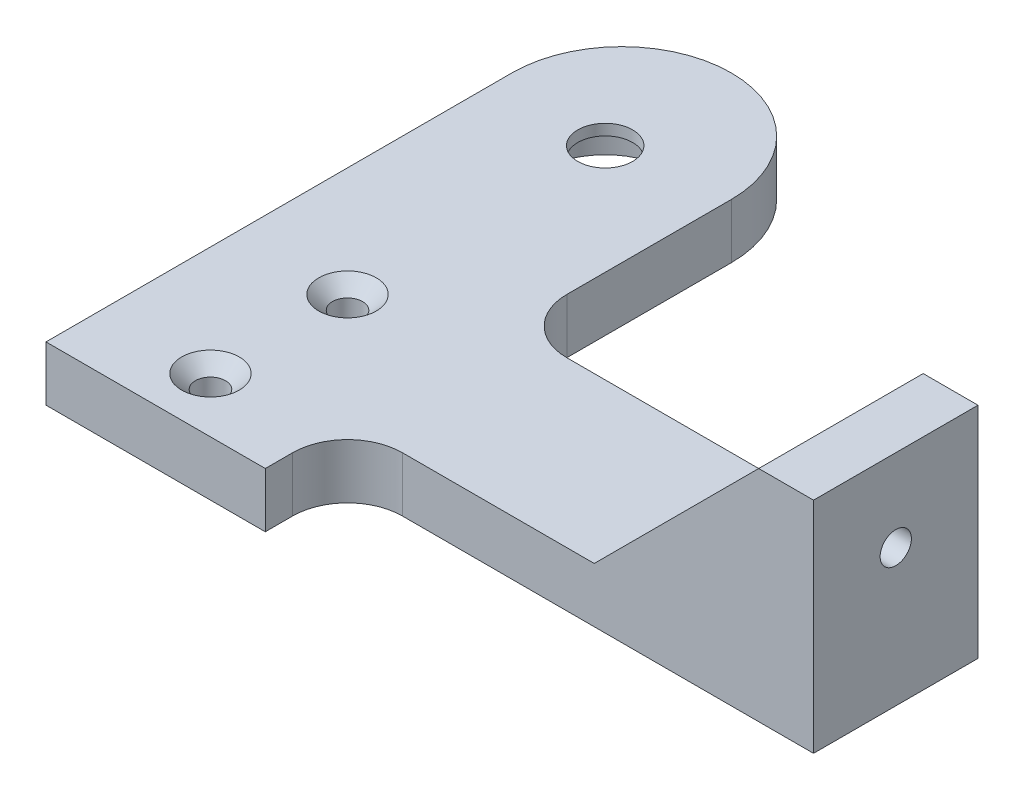
ISO-10303-21;
HEADER;
FILE_DESCRIPTION(('STEP AP214'),'2;1');
FILE_NAME('part.step','',(''),(''),'','','');
FILE_SCHEMA(('AUTOMOTIVE_DESIGN { 1 0 10303 214 1 1 1 1 }'));
ENDSEC;
DATA;
#1=APPLICATION_CONTEXT('core data for automotive mechanical design processes');
#2=APPLICATION_PROTOCOL_DEFINITION('international standard','automotive_design',2000,#1);
#3=PRODUCT_CONTEXT('',#1,'mechanical');
#4=PRODUCT('Part','Part','',(#3));
#5=PRODUCT_RELATED_PRODUCT_CATEGORY('part','',(#4));
#6=PRODUCT_DEFINITION_FORMATION('','',#4);
#7=PRODUCT_DEFINITION_CONTEXT('part definition',#1,'design');
#8=PRODUCT_DEFINITION('design','',#6,#7);
#9=PRODUCT_DEFINITION_SHAPE('','',#8);
#10=(LENGTH_UNIT() NAMED_UNIT(*) SI_UNIT(.MILLI.,.METRE.));
#11=(NAMED_UNIT(*) PLANE_ANGLE_UNIT() SI_UNIT($,.RADIAN.));
#12=(NAMED_UNIT(*) SI_UNIT($,.STERADIAN.) SOLID_ANGLE_UNIT());
#13=UNCERTAINTY_MEASURE_WITH_UNIT(LENGTH_MEASURE(1.E-05),#10,'distance_accuracy_value','');
#14=(GEOMETRIC_REPRESENTATION_CONTEXT(3) GLOBAL_UNCERTAINTY_ASSIGNED_CONTEXT((#13)) GLOBAL_UNIT_ASSIGNED_CONTEXT((#10,
#11,#12)) REPRESENTATION_CONTEXT('',''));
#15=CARTESIAN_POINT('',(0.,0.,0.));
#16=DIRECTION('',(0.,0.,1.));
#17=DIRECTION('',(1.,0.,0.));
#18=AXIS2_PLACEMENT_3D('',#15,#16,#17);
#19=CARTESIAN_POINT('',(95.,40.,-15.));
#20=DIRECTION('',(1.,0.,0.));
#21=DIRECTION('',(0.,0.,-1.));
#22=AXIS2_PLACEMENT_3D('',#19,#20,#21);
#23=PLANE('',#22);
#24=CARTESIAN_POINT('',(95.,25.,-30.));
#25=DIRECTION('',(1.,0.,0.));
#26=DIRECTION('',(0.,0.,-1.));
#27=AXIS2_PLACEMENT_3D('',#24,#25,#26);
#28=CIRCLE('',#27,2.85);
#29=CARTESIAN_POINT('',(95.,25.,-32.85));
#30=VERTEX_POINT('',#29);
#31=EDGE_CURVE('E182',#30,#30,#28,.T.);
#32=ORIENTED_EDGE('',*,*,#31,.T.);
#33=EDGE_LOOP('',(#32));
#34=FACE_BOUND('',#33,.T.);
#35=DIRECTION('',(0.,1.,0.));
#36=VECTOR('',#35,1.);
#37=CARTESIAN_POINT('',(95.,10.,-40.));
#38=LINE('',#37,#36);
#39=CARTESIAN_POINT('',(95.,13.5355339059327,-40.));
#40=VERTEX_POINT('',#39);
#41=CARTESIAN_POINT('',(95.,40.,-40.));
#42=VERTEX_POINT('',#41);
#43=EDGE_CURVE('E55',#40,#42,#38,.T.);
#44=ORIENTED_EDGE('',*,*,#43,.F.);
#45=DIRECTION('',(0.,0.,-1.));
#46=VECTOR('',#45,1.);
#47=CARTESIAN_POINT('',(95.,13.5355339059327,-15.));
#48=LINE('',#47,#46);
#49=CARTESIAN_POINT('',(95.,13.5355339059327,-20.));
#50=VERTEX_POINT('',#49);
#51=EDGE_CURVE('E205',#50,#40,#48,.T.);
#52=ORIENTED_EDGE('',*,*,#51,.F.);
#53=DIRECTION('',(0.,1.,0.));
#54=VECTOR('',#53,1.);
#55=CARTESIAN_POINT('',(95.,10.,-20.));
#56=LINE('',#55,#54);
#57=CARTESIAN_POINT('',(95.,39.9999999999997,-20.));
#58=VERTEX_POINT('',#57);
#59=EDGE_CURVE('E165',#50,#58,#56,.T.);
#60=ORIENTED_EDGE('',*,*,#59,.T.);
#61=DIRECTION('',(0.,0.,-1.));
#62=VECTOR('',#61,1.);
#63=CARTESIAN_POINT('',(95.,40.,-15.));
#64=LINE('',#63,#62);
#65=EDGE_CURVE('E207',#58,#42,#64,.T.);
#66=ORIENTED_EDGE('',*,*,#65,.T.);
#67=EDGE_LOOP('',(#44,#52,#60,#66));
#68=FACE_BOUND('',#67,.T.);
#69=ADVANCED_FACE('F39',(#34,#68),#23,.F.);
#70=CARTESIAN_POINT('',(95.,13.5355339059327,-15.));
#71=DIRECTION('',(0.707106781186543,-0.707106781186552,0.));
#72=DIRECTION('',(0.707106781186552,0.707106781186543,0.));
#73=AXIS2_PLACEMENT_3D('',#70,#71,#72);
#74=PLANE('',#73);
#75=DIRECTION('',(0.707106781186552,0.707106781186543,0.));
#76=VECTOR('',#75,1.);
#77=CARTESIAN_POINT('',(95.,13.5355339059327,-40.));
#78=LINE('',#77,#76);
#79=CARTESIAN_POINT('',(91.4644660940673,10.,-40.));
#80=VERTEX_POINT('',#79);
#81=EDGE_CURVE('E699',#80,#40,#78,.T.);
#82=ORIENTED_EDGE('',*,*,#81,.F.);
#83=DIRECTION('',(0.,0.,-1.));
#84=VECTOR('',#83,1.);
#85=CARTESIAN_POINT('',(91.4644660940673,10.,-15.));
#86=LINE('',#85,#84);
#87=CARTESIAN_POINT('',(91.4644660940672,10.,-20.));
#88=VERTEX_POINT('',#87);
#89=EDGE_CURVE('E196',#88,#80,#86,.T.);
#90=ORIENTED_EDGE('',*,*,#89,.F.);
#91=DIRECTION('',(-0.707106781186552,-0.707106781186543,0.));
#92=VECTOR('',#91,1.);
#93=CARTESIAN_POINT('',(95.,13.5355339059327,-20.));
#94=LINE('',#93,#92);
#95=EDGE_CURVE('E162',#50,#88,#94,.T.);
#96=ORIENTED_EDGE('',*,*,#95,.F.);
#97=ORIENTED_EDGE('',*,*,#51,.T.);
#98=EDGE_LOOP('',(#82,#90,#96,#97));
#99=FACE_BOUND('',#98,.T.);
#100=ADVANCED_FACE('F334',(#99),#74,.F.);
#101=CARTESIAN_POINT('',(0.,10.,-85.0000000000001));
#102=DIRECTION('',(0.,-1.,0.));
#103=DIRECTION('',(0.,0.,-1.));
#104=AXIS2_PLACEMENT_3D('',#101,#102,#103);
#105=PLANE('',#104);
#106=CARTESIAN_POINT('',(0.,10.,-35.));
#107=DIRECTION('',(0.,-1.,0.));
#108=DIRECTION('',(0.,0.,-1.));
#109=AXIS2_PLACEMENT_3D('',#106,#107,#108);
#110=CIRCLE('',#109,5.25);
#111=CARTESIAN_POINT('',(0.,10.,-40.25));
#112=VERTEX_POINT('',#111);
#113=EDGE_CURVE('E48',#112,#112,#110,.T.);
#114=ORIENTED_EDGE('',*,*,#113,.T.);
#115=EDGE_LOOP('',(#114));
#116=FACE_BOUND('',#115,.T.);
#117=CARTESIAN_POINT('',(0.,10.,-10.));
#118=DIRECTION('',(0.,-1.,0.));
#119=DIRECTION('',(0.,0.,-1.));
#120=AXIS2_PLACEMENT_3D('',#117,#118,#119);
#121=CIRCLE('',#120,5.25000000000001);
#122=CARTESIAN_POINT('',(0.,10.,-15.25));
#123=VERTEX_POINT('',#122);
#124=EDGE_CURVE('E294',#123,#123,#121,.T.);
#125=ORIENTED_EDGE('',*,*,#124,.T.);
#126=EDGE_LOOP('',(#125));
#127=FACE_BOUND('',#126,.T.);
#128=CARTESIAN_POINT('',(0.,10.,-82.));
#129=DIRECTION('',(0.,1.,0.));
#130=DIRECTION('',(0.,0.,1.));
#131=AXIS2_PLACEMENT_3D('',#128,#129,#130);
#132=CIRCLE('',#131,5.);
#133=CARTESIAN_POINT('',(0.,10.,-77.));
#134=VERTEX_POINT('',#133);
#135=EDGE_CURVE('E216',#134,#134,#132,.T.);
#136=ORIENTED_EDGE('',*,*,#135,.F.);
#137=EDGE_LOOP('',(#136));
#138=FACE_BOUND('',#137,.T.);
#139=DIRECTION('',(0.,0.,-1.));
#140=VECTOR('',#139,1.);
#141=CARTESIAN_POINT('',(65.,10.,-40.));
#142=LINE('',#141,#140);
#143=CARTESIAN_POINT('',(65.,10.,-40.));
#144=VERTEX_POINT('',#143);
#145=CARTESIAN_POINT('',(65.,10.,-45.));
#146=VERTEX_POINT('',#145);
#147=EDGE_CURVE('E701',#144,#146,#142,.T.);
#148=ORIENTED_EDGE('',*,*,#147,.T.);
#149=DIRECTION('',(-1.,0.,0.));
#150=VECTOR('',#149,1.);
#151=CARTESIAN_POINT('',(91.4644660940673,10.,-45.));
#152=LINE('',#151,#150);
#153=CARTESIAN_POINT('',(30.,10.,-45.));
#154=VERTEX_POINT('',#153);
#155=EDGE_CURVE('E190',#146,#154,#152,.T.);
#156=ORIENTED_EDGE('',*,*,#155,.T.);
#157=CARTESIAN_POINT('',(30.,10.,-55.));
#158=DIRECTION('',(0.,-1.,0.));
#159=DIRECTION('',(0.,0.,-1.));
#160=AXIS2_PLACEMENT_3D('',#157,#158,#159);
#161=CIRCLE('',#160,10.);
#162=CARTESIAN_POINT('',(20.,10.,-55.));
#163=VERTEX_POINT('',#162);
#164=EDGE_CURVE('E282',#154,#163,#161,.T.);
#165=ORIENTED_EDGE('',*,*,#164,.T.);
#166=DIRECTION('',(0.,0.,-1.));
#167=VECTOR('',#166,1.);
#168=CARTESIAN_POINT('',(20.,10.,0.));
#169=LINE('',#168,#167);
#170=CARTESIAN_POINT('',(20.,10.,-85.0000000000001));
#171=VERTEX_POINT('',#170);
#172=EDGE_CURVE('E227',#163,#171,#169,.T.);
#173=ORIENTED_EDGE('',*,*,#172,.T.);
#174=CARTESIAN_POINT('',(0.,10.,-85.0000000000001));
#175=DIRECTION('',(0.,1.,0.));
#176=DIRECTION('',(0.,0.,-1.));
#177=AXIS2_PLACEMENT_3D('',#174,#175,#176);
#178=CIRCLE('',#177,20.);
#179=CARTESIAN_POINT('',(-20.,10.,-85.0000000000001));
#180=VERTEX_POINT('',#179);
#181=EDGE_CURVE('E231',#171,#180,#178,.T.);
#182=ORIENTED_EDGE('',*,*,#181,.T.);
#183=DIRECTION('',(0.,0.,1.));
#184=VECTOR('',#183,1.);
#185=CARTESIAN_POINT('',(-20.,10.,-85.0000000000001));
#186=LINE('',#185,#184);
#187=CARTESIAN_POINT('',(-20.,10.,0.));
#188=VERTEX_POINT('',#187);
#189=EDGE_CURVE('E219',#180,#188,#186,.T.);
#190=ORIENTED_EDGE('',*,*,#189,.T.);
#191=DIRECTION('',(1.,0.,0.));
#192=VECTOR('',#191,1.);
#193=CARTESIAN_POINT('',(-20.,10.,0.));
#194=LINE('',#193,#192);
#195=CARTESIAN_POINT('',(20.,10.,0.));
#196=VERTEX_POINT('',#195);
#197=EDGE_CURVE('E224',#188,#196,#194,.T.);
#198=ORIENTED_EDGE('',*,*,#197,.T.);
#199=CARTESIAN_POINT('',(20.,10.,-5.));
#200=VERTEX_POINT('',#199);
#201=EDGE_CURVE('E228',#196,#200,#169,.T.);
#202=ORIENTED_EDGE('',*,*,#201,.T.);
#203=CARTESIAN_POINT('',(30.,10.,-5.));
#204=DIRECTION('',(0.,-1.,0.));
#205=DIRECTION('',(0.,0.,-1.));
#206=AXIS2_PLACEMENT_3D('',#203,#204,#205);
#207=CIRCLE('',#206,10.);
#208=CARTESIAN_POINT('',(30.,10.,-15.));
#209=VERTEX_POINT('',#208);
#210=EDGE_CURVE('E286',#200,#209,#207,.T.);
#211=ORIENTED_EDGE('',*,*,#210,.T.);
#212=DIRECTION('',(-1.,0.,0.));
#213=VECTOR('',#212,1.);
#214=CARTESIAN_POINT('',(91.4644660940673,10.,-15.));
#215=LINE('',#214,#213);
#216=CARTESIAN_POINT('',(65.,10.,-15.));
#217=VERTEX_POINT('',#216);
#218=EDGE_CURVE('E178',#217,#209,#215,.T.);
#219=ORIENTED_EDGE('',*,*,#218,.F.);
#220=DIRECTION('',(0.,0.,1.));
#221=VECTOR('',#220,1.);
#222=CARTESIAN_POINT('',(65.,10.,-20.));
#223=LINE('',#222,#221);
#224=CARTESIAN_POINT('',(65.,10.,-20.));
#225=VERTEX_POINT('',#224);
#226=EDGE_CURVE('E170',#225,#217,#223,.T.);
#227=ORIENTED_EDGE('',*,*,#226,.F.);
#228=DIRECTION('',(1.,0.,0.));
#229=VECTOR('',#228,1.);
#230=CARTESIAN_POINT('',(65.,10.,-20.));
#231=LINE('',#230,#229);
#232=EDGE_CURVE('E156',#225,#88,#231,.T.);
#233=ORIENTED_EDGE('',*,*,#232,.T.);
#234=ORIENTED_EDGE('',*,*,#89,.T.);
#235=DIRECTION('',(1.,0.,0.));
#236=VECTOR('',#235,1.);
#237=CARTESIAN_POINT('',(65.,10.,-40.));
#238=LINE('',#237,#236);
#239=EDGE_CURVE('E63',#144,#80,#238,.T.);
#240=ORIENTED_EDGE('',*,*,#239,.F.);
#241=EDGE_LOOP('',(#148,#156,#165,#173,#182,#190,#198,#202,#211,#219,#227,#233,#234,#240));
#242=FACE_BOUND('',#241,.T.);
#243=ADVANCED_FACE('F176',(#116,#127,#138,#242),#105,.F.);
#244=CARTESIAN_POINT('',(20.,8.,-85.0000000000001));
#245=DIRECTION('',(-1.,0.,0.));
#246=DIRECTION('',(0.,0.,1.));
#247=AXIS2_PLACEMENT_3D('',#244,#245,#246);
#248=PLANE('',#247);
#249=ORIENTED_EDGE('',*,*,#172,.F.);
#250=DIRECTION('',(0.,-1.,0.));
#251=VECTOR('',#250,1.);
#252=CARTESIAN_POINT('',(20.,0.,-55.));
#253=LINE('',#252,#251);
#254=CARTESIAN_POINT('',(20.,0.,-55.));
#255=VERTEX_POINT('',#254);
#256=EDGE_CURVE('E269',#163,#255,#253,.T.);
#257=ORIENTED_EDGE('',*,*,#256,.T.);
#258=DIRECTION('',(0.,0.,-1.));
#259=VECTOR('',#258,1.);
#260=CARTESIAN_POINT('',(20.,0.,-85.0000000000001));
#261=LINE('',#260,#259);
#262=CARTESIAN_POINT('',(20.,0.,-85.0000000000001));
#263=VERTEX_POINT('',#262);
#264=EDGE_CURVE('E253',#255,#263,#261,.T.);
#265=ORIENTED_EDGE('',*,*,#264,.T.);
#266=DIRECTION('',(0.,-1.,0.));
#267=VECTOR('',#266,1.);
#268=CARTESIAN_POINT('',(20.,8.,-85.0000000000001));
#269=LINE('',#268,#267);
#270=EDGE_CURVE('E257',#171,#263,#269,.T.);
#271=ORIENTED_EDGE('',*,*,#270,.F.);
#272=EDGE_LOOP('',(#249,#257,#265,#271));
#273=FACE_BOUND('',#272,.T.);
#274=ADVANCED_FACE('F318',(#273),#248,.F.);
#275=CARTESIAN_POINT('',(0.,0.,-85.0000000000001));
#276=DIRECTION('',(0.,-1.,0.));
#277=DIRECTION('',(0.,0.,-1.));
#278=AXIS2_PLACEMENT_3D('',#275,#276,#277);
#279=PLANE('',#278);
#280=CARTESIAN_POINT('',(0.,0.,-82.));
#281=DIRECTION('',(0.,1.,0.));
#282=DIRECTION('',(0.,0.,1.));
#283=AXIS2_PLACEMENT_3D('',#280,#281,#282);
#284=CIRCLE('',#283,12.1);
#285=CARTESIAN_POINT('',(0.,0.,-69.9));
#286=VERTEX_POINT('',#285);
#287=EDGE_CURVE('E238',#286,#286,#284,.T.);
#288=ORIENTED_EDGE('',*,*,#287,.T.);
#289=EDGE_LOOP('',(#288));
#290=FACE_BOUND('',#289,.T.);
#291=CARTESIAN_POINT('',(0.,0.,-85.0000000000001));
#292=DIRECTION('',(0.,1.,0.));
#293=DIRECTION('',(0.,0.,-1.));
#294=AXIS2_PLACEMENT_3D('',#291,#292,#293);
#295=CIRCLE('',#294,20.);
#296=CARTESIAN_POINT('',(-20.,0.,-85.0000000000001));
#297=VERTEX_POINT('',#296);
#298=EDGE_CURVE('E246',#263,#297,#295,.T.);
#299=ORIENTED_EDGE('',*,*,#298,.F.);
#300=ORIENTED_EDGE('',*,*,#264,.F.);
#301=CARTESIAN_POINT('',(30.,0.,-55.));
#302=DIRECTION('',(0.,-1.,0.));
#303=DIRECTION('',(0.,0.,-1.));
#304=AXIS2_PLACEMENT_3D('',#301,#302,#303);
#305=CIRCLE('',#304,10.);
#306=CARTESIAN_POINT('',(30.,0.,-45.));
#307=VERTEX_POINT('',#306);
#308=EDGE_CURVE('E280',#255,#307,#305,.F.);
#309=ORIENTED_EDGE('',*,*,#308,.T.);
#310=DIRECTION('',(1.,0.,0.));
#311=VECTOR('',#310,1.);
#312=CARTESIAN_POINT('',(20.,0.,-45.));
#313=LINE('',#312,#311);
#314=CARTESIAN_POINT('',(105.,0.,-45.));
#315=VERTEX_POINT('',#314);
#316=EDGE_CURVE('E197',#307,#315,#313,.T.);
#317=ORIENTED_EDGE('',*,*,#316,.T.);
#318=DIRECTION('',(0.,0.,-1.));
#319=VECTOR('',#318,1.);
#320=CARTESIAN_POINT('',(105.,0.,-15.));
#321=LINE('',#320,#319);
#322=CARTESIAN_POINT('',(105.,0.,-15.));
#323=VERTEX_POINT('',#322);
#324=EDGE_CURVE('E212',#323,#315,#321,.T.);
#325=ORIENTED_EDGE('',*,*,#324,.F.);
#326=DIRECTION('',(1.,0.,0.));
#327=VECTOR('',#326,1.);
#328=CARTESIAN_POINT('',(20.,0.,-15.));
#329=LINE('',#328,#327);
#330=CARTESIAN_POINT('',(30.,0.,-15.));
#331=VERTEX_POINT('',#330);
#332=EDGE_CURVE('E187',#331,#323,#329,.T.);
#333=ORIENTED_EDGE('',*,*,#332,.F.);
#334=CARTESIAN_POINT('',(30.,0.,-5.));
#335=DIRECTION('',(0.,-1.,0.));
#336=DIRECTION('',(0.,0.,-1.));
#337=AXIS2_PLACEMENT_3D('',#334,#335,#336);
#338=CIRCLE('',#337,10.);
#339=CARTESIAN_POINT('',(20.,0.,-5.));
#340=VERTEX_POINT('',#339);
#341=EDGE_CURVE('E284',#331,#340,#338,.F.);
#342=ORIENTED_EDGE('',*,*,#341,.T.);
#343=CARTESIAN_POINT('',(20.,0.,0.));
#344=VERTEX_POINT('',#343);
#345=EDGE_CURVE('E254',#344,#340,#261,.T.);
#346=ORIENTED_EDGE('',*,*,#345,.F.);
#347=DIRECTION('',(1.,0.,0.));
#348=VECTOR('',#347,1.);
#349=CARTESIAN_POINT('',(-20.,0.,0.));
#350=LINE('',#349,#348);
#351=CARTESIAN_POINT('',(-20.,0.,0.));
#352=VERTEX_POINT('',#351);
#353=EDGE_CURVE('E251',#352,#344,#350,.T.);
#354=ORIENTED_EDGE('',*,*,#353,.F.);
#355=DIRECTION('',(0.,0.,1.));
#356=VECTOR('',#355,1.);
#357=CARTESIAN_POINT('',(-20.,0.,-85.0000000000001));
#358=LINE('',#357,#356);
#359=EDGE_CURVE('E249',#297,#352,#358,.T.);
#360=ORIENTED_EDGE('',*,*,#359,.F.);
#361=EDGE_LOOP('',(#299,#300,#309,#317,#325,#333,#342,#346,#354,#360));
#362=FACE_BOUND('',#361,.T.);
#363=CARTESIAN_POINT('',(0.,0.,-10.));
#364=DIRECTION('',(0.,1.,0.));
#365=DIRECTION('',(0.,0.,1.));
#366=AXIS2_PLACEMENT_3D('',#363,#364,#365);
#367=CIRCLE('',#366,2.75);
#368=CARTESIAN_POINT('',(0.,0.,-7.25));
#369=VERTEX_POINT('',#368);
#370=EDGE_CURVE('E243',#369,#369,#367,.T.);
#371=ORIENTED_EDGE('',*,*,#370,.T.);
#372=EDGE_LOOP('',(#371));
#373=FACE_BOUND('',#372,.T.);
#374=CARTESIAN_POINT('',(0.,0.,-35.));
#375=DIRECTION('',(0.,1.,0.));
#376=DIRECTION('',(0.,0.,1.));
#377=AXIS2_PLACEMENT_3D('',#374,#375,#376);
#378=CIRCLE('',#377,2.75);
#379=CARTESIAN_POINT('',(0.,0.,-32.25));
#380=VERTEX_POINT('',#379);
#381=EDGE_CURVE('E235',#380,#380,#378,.T.);
#382=ORIENTED_EDGE('',*,*,#381,.T.);
#383=EDGE_LOOP('',(#382));
#384=FACE_BOUND('',#383,.T.);
#385=ADVANCED_FACE('F315',(#290,#362,#373,#384),#279,.T.);
#386=CARTESIAN_POINT('',(0.,8.,-85.0000000000001));
#387=DIRECTION('',(0.,-1.,0.));
#388=DIRECTION('',(0.,0.,-1.));
#389=AXIS2_PLACEMENT_3D('',#386,#387,#388);
#390=CYLINDRICAL_SURFACE('',#389,20.);
#391=ORIENTED_EDGE('',*,*,#298,.T.);
#392=DIRECTION('',(0.,-1.,0.));
#393=VECTOR('',#392,1.);
#394=CARTESIAN_POINT('',(-20.,8.,-85.0000000000001));
#395=LINE('',#394,#393);
#396=EDGE_CURVE('E266',#180,#297,#395,.T.);
#397=ORIENTED_EDGE('',*,*,#396,.F.);
#398=ORIENTED_EDGE('',*,*,#181,.F.);
#399=ORIENTED_EDGE('',*,*,#270,.T.);
#400=EDGE_LOOP('',(#391,#397,#398,#399));
#401=FACE_BOUND('',#400,.T.);
#402=ADVANCED_FACE('F317',(#401),#390,.T.);
#403=CARTESIAN_POINT('',(-20.,8.,-85.0000000000001));
#404=DIRECTION('',(1.,0.,0.));
#405=DIRECTION('',(0.,0.,-1.));
#406=AXIS2_PLACEMENT_3D('',#403,#404,#405);
#407=PLANE('',#406);
#408=ORIENTED_EDGE('',*,*,#359,.T.);
#409=DIRECTION('',(0.,-1.,0.));
#410=VECTOR('',#409,1.);
#411=CARTESIAN_POINT('',(-20.,8.,0.));
#412=LINE('',#411,#410);
#413=EDGE_CURVE('E263',#188,#352,#412,.T.);
#414=ORIENTED_EDGE('',*,*,#413,.F.);
#415=ORIENTED_EDGE('',*,*,#189,.F.);
#416=ORIENTED_EDGE('',*,*,#396,.T.);
#417=EDGE_LOOP('',(#408,#414,#415,#416));
#418=FACE_BOUND('',#417,.T.);
#419=ADVANCED_FACE('F325',(#418),#407,.F.);
#420=CARTESIAN_POINT('',(-20.,8.,0.));
#421=DIRECTION('',(0.,0.,-1.));
#422=DIRECTION('',(-1.,0.,0.));
#423=AXIS2_PLACEMENT_3D('',#420,#421,#422);
#424=PLANE('',#423);
#425=ORIENTED_EDGE('',*,*,#353,.T.);
#426=DIRECTION('',(0.,-1.,0.));
#427=VECTOR('',#426,1.);
#428=CARTESIAN_POINT('',(20.,8.,0.));
#429=LINE('',#428,#427);
#430=EDGE_CURVE('E260',#196,#344,#429,.T.);
#431=ORIENTED_EDGE('',*,*,#430,.F.);
#432=ORIENTED_EDGE('',*,*,#197,.F.);
#433=ORIENTED_EDGE('',*,*,#413,.T.);
#434=EDGE_LOOP('',(#425,#431,#432,#433));
#435=FACE_BOUND('',#434,.T.);
#436=ADVANCED_FACE('F370',(#435),#424,.F.);
#437=ORIENTED_EDGE('',*,*,#345,.T.);
#438=DIRECTION('',(0.,-1.,0.));
#439=VECTOR('',#438,1.);
#440=CARTESIAN_POINT('',(20.,8.,-5.));
#441=LINE('',#440,#439);
#442=EDGE_CURVE('E278',#340,#200,#441,.F.);
#443=ORIENTED_EDGE('',*,*,#442,.T.);
#444=ORIENTED_EDGE('',*,*,#201,.F.);
#445=ORIENTED_EDGE('',*,*,#430,.T.);
#446=EDGE_LOOP('',(#437,#443,#444,#445));
#447=FACE_BOUND('',#446,.T.);
#448=ADVANCED_FACE('F330',(#447),#248,.F.);
#449=CARTESIAN_POINT('',(0.,8.,-10.));
#450=DIRECTION('',(0.,-1.,0.));
#451=DIRECTION('',(0.,0.,-1.));
#452=AXIS2_PLACEMENT_3D('',#449,#450,#451);
#453=CYLINDRICAL_SURFACE('',#452,2.75);
#454=CARTESIAN_POINT('',(0.,7.50000000000001,-10.));
#455=DIRECTION('',(0.,-1.,0.));
#456=DIRECTION('',(0.,0.,-1.));
#457=AXIS2_PLACEMENT_3D('',#454,#455,#456);
#458=CIRCLE('',#457,2.75);
#459=CARTESIAN_POINT('',(0.,7.50000000000001,-12.75));
#460=VERTEX_POINT('',#459);
#461=EDGE_CURVE('E11',#460,#460,#458,.F.);
#462=ORIENTED_EDGE('',*,*,#461,.T.);
#463=EDGE_LOOP('',(#462));
#464=FACE_BOUND('',#463,.T.);
#465=ORIENTED_EDGE('',*,*,#370,.F.);
#466=EDGE_LOOP('',(#465));
#467=FACE_BOUND('',#466,.T.);
#468=ADVANCED_FACE('F363',(#464,#467),#453,.F.);
#469=CARTESIAN_POINT('',(0.,8.,-82.));
#470=DIRECTION('',(0.,-1.,0.));
#471=DIRECTION('',(0.,0.,-1.));
#472=AXIS2_PLACEMENT_3D('',#469,#470,#471);
#473=CYLINDRICAL_SURFACE('',#472,12.1);
#474=CARTESIAN_POINT('',(0.,8.,-82.));
#475=DIRECTION('',(0.,1.,0.));
#476=DIRECTION('',(0.,0.,1.));
#477=AXIS2_PLACEMENT_3D('',#474,#475,#476);
#478=CIRCLE('',#477,12.1);
#479=CARTESIAN_POINT('',(0.,8.,-69.9));
#480=VERTEX_POINT('',#479);
#481=EDGE_CURVE('E234',#480,#480,#478,.T.);
#482=ORIENTED_EDGE('',*,*,#481,.T.);
#483=EDGE_LOOP('',(#482));
#484=FACE_BOUND('',#483,.T.);
#485=ORIENTED_EDGE('',*,*,#287,.F.);
#486=EDGE_LOOP('',(#485));
#487=FACE_BOUND('',#486,.T.);
#488=ADVANCED_FACE('F311',(#484,#487),#473,.F.);
#489=CARTESIAN_POINT('',(0.,8.,-35.));
#490=DIRECTION('',(0.,-1.,0.));
#491=DIRECTION('',(0.,0.,-1.));
#492=AXIS2_PLACEMENT_3D('',#489,#490,#491);
#493=CYLINDRICAL_SURFACE('',#492,2.75);
#494=CARTESIAN_POINT('',(0.,7.50000000000001,-35.));
#495=DIRECTION('',(0.,-1.,0.));
#496=DIRECTION('',(0.,0.,-1.));
#497=AXIS2_PLACEMENT_3D('',#494,#495,#496);
#498=CIRCLE('',#497,2.75);
#499=CARTESIAN_POINT('',(0.,7.50000000000001,-37.75));
#500=VERTEX_POINT('',#499);
#501=EDGE_CURVE('E291',#500,#500,#498,.F.);
#502=ORIENTED_EDGE('',*,*,#501,.T.);
#503=EDGE_LOOP('',(#502));
#504=FACE_BOUND('',#503,.T.);
#505=ORIENTED_EDGE('',*,*,#381,.F.);
#506=EDGE_LOOP('',(#505));
#507=FACE_BOUND('',#506,.T.);
#508=ADVANCED_FACE('F307',(#504,#507),#493,.F.);
#509=CARTESIAN_POINT('',(0.,8.,-85.0000000000001));
#510=DIRECTION('',(0.,-1.,0.));
#511=DIRECTION('',(0.,0.,-1.));
#512=AXIS2_PLACEMENT_3D('',#509,#510,#511);
#513=PLANE('',#512);
#514=CARTESIAN_POINT('',(0.,8.,-82.));
#515=DIRECTION('',(0.,1.,0.));
#516=DIRECTION('',(0.,0.,1.));
#517=AXIS2_PLACEMENT_3D('',#514,#515,#516);
#518=CIRCLE('',#517,5.);
#519=CARTESIAN_POINT('',(0.,8.,-77.));
#520=VERTEX_POINT('',#519);
#521=EDGE_CURVE('E215',#520,#520,#518,.T.);
#522=ORIENTED_EDGE('',*,*,#521,.T.);
#523=EDGE_LOOP('',(#522));
#524=FACE_BOUND('',#523,.T.);
#525=ORIENTED_EDGE('',*,*,#481,.F.);
#526=EDGE_LOOP('',(#525));
#527=FACE_BOUND('',#526,.T.);
#528=ADVANCED_FACE('F310',(#524,#527),#513,.T.);
#529=CARTESIAN_POINT('',(0.,10.,-82.));
#530=DIRECTION('',(0.,-1.,0.));
#531=DIRECTION('',(0.,0.,-1.));
#532=AXIS2_PLACEMENT_3D('',#529,#530,#531);
#533=CYLINDRICAL_SURFACE('',#532,5.);
#534=ORIENTED_EDGE('',*,*,#135,.T.);
#535=EDGE_LOOP('',(#534));
#536=FACE_BOUND('',#535,.T.);
#537=ORIENTED_EDGE('',*,*,#521,.F.);
#538=EDGE_LOOP('',(#537));
#539=FACE_BOUND('',#538,.T.);
#540=ADVANCED_FACE('F352',(#536,#539),#533,.F.);
#541=CARTESIAN_POINT('',(105.,0.,-15.));
#542=DIRECTION('',(-1.,0.,0.));
#543=DIRECTION('',(0.,-1.,0.));
#544=AXIS2_PLACEMENT_3D('',#541,#542,#543);
#545=PLANE('',#544);
#546=CARTESIAN_POINT('',(105.,25.,-30.));
#547=DIRECTION('',(1.,0.,0.));
#548=DIRECTION('',(0.,1.,0.));
#549=AXIS2_PLACEMENT_3D('',#546,#547,#548);
#550=CIRCLE('',#549,2.85);
#551=CARTESIAN_POINT('',(105.,27.85,-30.));
#552=VERTEX_POINT('',#551);
#553=EDGE_CURVE('E179',#552,#552,#550,.T.);
#554=ORIENTED_EDGE('',*,*,#553,.F.);
#555=EDGE_LOOP('',(#554));
#556=FACE_BOUND('',#555,.T.);
#557=DIRECTION('',(0.,1.,0.));
#558=VECTOR('',#557,1.);
#559=CARTESIAN_POINT('',(105.,0.,-45.));
#560=LINE('',#559,#558);
#561=CARTESIAN_POINT('',(105.,40.,-45.));
#562=VERTEX_POINT('',#561);
#563=EDGE_CURVE('E199',#315,#562,#560,.T.);
#564=ORIENTED_EDGE('',*,*,#563,.T.);
#565=DIRECTION('',(0.,0.,-1.));
#566=VECTOR('',#565,1.);
#567=CARTESIAN_POINT('',(105.,40.,-15.));
#568=LINE('',#567,#566);
#569=CARTESIAN_POINT('',(105.,40.,-15.));
#570=VERTEX_POINT('',#569);
#571=EDGE_CURVE('E209',#570,#562,#568,.T.);
#572=ORIENTED_EDGE('',*,*,#571,.F.);
#573=DIRECTION('',(0.,1.,0.));
#574=VECTOR('',#573,1.);
#575=CARTESIAN_POINT('',(105.,0.,-15.));
#576=LINE('',#575,#574);
#577=EDGE_CURVE('E189',#323,#570,#576,.T.);
#578=ORIENTED_EDGE('',*,*,#577,.F.);
#579=ORIENTED_EDGE('',*,*,#324,.T.);
#580=EDGE_LOOP('',(#564,#572,#578,#579));
#581=FACE_BOUND('',#580,.T.);
#582=ADVANCED_FACE('F348',(#556,#581),#545,.F.);
#583=CARTESIAN_POINT('',(105.,40.,-15.));
#584=DIRECTION('',(0.,-1.,0.));
#585=DIRECTION('',(0.,0.,-1.));
#586=AXIS2_PLACEMENT_3D('',#583,#584,#585);
#587=PLANE('',#586);
#588=DIRECTION('',(-1.,0.,0.));
#589=VECTOR('',#588,1.);
#590=CARTESIAN_POINT('',(105.,40.,-45.));
#591=LINE('',#590,#589);
#592=CARTESIAN_POINT('',(95.,40.,-45.));
#593=VERTEX_POINT('',#592);
#594=EDGE_CURVE('E201',#562,#593,#591,.T.);
#595=ORIENTED_EDGE('',*,*,#594,.T.);
#596=DIRECTION('',(0.,0.,-1.));
#597=VECTOR('',#596,1.);
#598=CARTESIAN_POINT('',(95.,39.9999999999997,-40.));
#599=LINE('',#598,#597);
#600=EDGE_CURVE('E703',#42,#593,#599,.T.);
#601=ORIENTED_EDGE('',*,*,#600,.F.);
#602=ORIENTED_EDGE('',*,*,#65,.F.);
#603=CARTESIAN_POINT('',(95.,39.9999999999997,-15.));
#604=VERTEX_POINT('',#603);
#605=EDGE_CURVE('E173',#604,#58,#64,.T.);
#606=ORIENTED_EDGE('',*,*,#605,.F.);
#607=DIRECTION('',(-1.,0.,0.));
#608=VECTOR('',#607,1.);
#609=CARTESIAN_POINT('',(105.,40.,-15.));
#610=LINE('',#609,#608);
#611=EDGE_CURVE('E192',#570,#604,#610,.T.);
#612=ORIENTED_EDGE('',*,*,#611,.F.);
#613=ORIENTED_EDGE('',*,*,#571,.T.);
#614=EDGE_LOOP('',(#595,#601,#602,#606,#612,#613));
#615=FACE_BOUND('',#614,.T.);
#616=ADVANCED_FACE('F344',(#615),#587,.F.);
#617=CARTESIAN_POINT('',(0.,0.,-15.));
#618=DIRECTION('',(0.,0.,1.));
#619=DIRECTION('',(1.,0.,0.));
#620=AXIS2_PLACEMENT_3D('',#617,#618,#619);
#621=PLANE('',#620);
#622=ORIENTED_EDGE('',*,*,#611,.T.);
#623=DIRECTION('',(-0.707106781186551,-0.707106781186543,0.));
#624=VECTOR('',#623,1.);
#625=CARTESIAN_POINT('',(95.,39.9999999999997,-15.));
#626=LINE('',#625,#624);
#627=EDGE_CURVE('E174',#604,#217,#626,.T.);
#628=ORIENTED_EDGE('',*,*,#627,.T.);
#629=ORIENTED_EDGE('',*,*,#218,.T.);
#630=DIRECTION('',(0.,-1.,0.));
#631=VECTOR('',#630,1.);
#632=CARTESIAN_POINT('',(30.,0.,-15.));
#633=LINE('',#632,#631);
#634=EDGE_CURVE('E275',#209,#331,#633,.T.);
#635=ORIENTED_EDGE('',*,*,#634,.T.);
#636=ORIENTED_EDGE('',*,*,#332,.T.);
#637=ORIENTED_EDGE('',*,*,#577,.T.);
#638=EDGE_LOOP('',(#622,#628,#629,#635,#636,#637));
#639=FACE_BOUND('',#638,.T.);
#640=ADVANCED_FACE('F347',(#639),#621,.T.);
#641=CARTESIAN_POINT('',(0.,0.,-45.));
#642=DIRECTION('',(0.,0.,1.));
#643=DIRECTION('',(1.,0.,0.));
#644=AXIS2_PLACEMENT_3D('',#641,#642,#643);
#645=PLANE('',#644);
#646=ORIENTED_EDGE('',*,*,#155,.F.);
#647=DIRECTION('',(-0.707106781186551,-0.707106781186543,0.));
#648=VECTOR('',#647,1.);
#649=CARTESIAN_POINT('',(95.,39.9999999999997,-45.));
#650=LINE('',#649,#648);
#651=EDGE_CURVE('E708',#593,#146,#650,.T.);
#652=ORIENTED_EDGE('',*,*,#651,.F.);
#653=ORIENTED_EDGE('',*,*,#594,.F.);
#654=ORIENTED_EDGE('',*,*,#563,.F.);
#655=ORIENTED_EDGE('',*,*,#316,.F.);
#656=DIRECTION('',(0.,-1.,0.));
#657=VECTOR('',#656,1.);
#658=CARTESIAN_POINT('',(30.,10.,-45.));
#659=LINE('',#658,#657);
#660=EDGE_CURVE('E272',#307,#154,#659,.F.);
#661=ORIENTED_EDGE('',*,*,#660,.T.);
#662=EDGE_LOOP('',(#646,#652,#653,#654,#655,#661));
#663=FACE_BOUND('',#662,.T.);
#664=ADVANCED_FACE('F447',(#663),#645,.F.);
#665=CARTESIAN_POINT('',(30.,8.,-55.));
#666=DIRECTION('',(0.,1.,0.));
#667=DIRECTION('',(0.,0.,1.));
#668=AXIS2_PLACEMENT_3D('',#665,#666,#667);
#669=CYLINDRICAL_SURFACE('',#668,10.);
#670=ORIENTED_EDGE('',*,*,#164,.F.);
#671=ORIENTED_EDGE('',*,*,#660,.F.);
#672=ORIENTED_EDGE('',*,*,#308,.F.);
#673=ORIENTED_EDGE('',*,*,#256,.F.);
#674=EDGE_LOOP('',(#670,#671,#672,#673));
#675=FACE_BOUND('',#674,.T.);
#676=ADVANCED_FACE('F439',(#675),#669,.F.);
#677=CARTESIAN_POINT('',(30.,0.,-5.));
#678=DIRECTION('',(0.,-1.,0.));
#679=DIRECTION('',(0.,0.,-1.));
#680=AXIS2_PLACEMENT_3D('',#677,#678,#679);
#681=CYLINDRICAL_SURFACE('',#680,10.);
#682=ORIENTED_EDGE('',*,*,#210,.F.);
#683=ORIENTED_EDGE('',*,*,#442,.F.);
#684=ORIENTED_EDGE('',*,*,#341,.F.);
#685=ORIENTED_EDGE('',*,*,#634,.F.);
#686=EDGE_LOOP('',(#682,#683,#684,#685));
#687=FACE_BOUND('',#686,.T.);
#688=ADVANCED_FACE('F430',(#687),#681,.F.);
#689=CARTESIAN_POINT('',(65.,25.,-30.));
#690=DIRECTION('',(1.,0.,0.));
#691=DIRECTION('',(0.,1.,0.));
#692=AXIS2_PLACEMENT_3D('',#689,#690,#691);
#693=CYLINDRICAL_SURFACE('',#692,2.85);
#694=ORIENTED_EDGE('',*,*,#553,.T.);
#695=EDGE_LOOP('',(#694));
#696=FACE_BOUND('',#695,.T.);
#697=ORIENTED_EDGE('',*,*,#31,.F.);
#698=EDGE_LOOP('',(#697));
#699=FACE_BOUND('',#698,.T.);
#700=ADVANCED_FACE('F422',(#696,#699),#693,.F.);
#701=CARTESIAN_POINT('',(0.,0.,-20.));
#702=DIRECTION('',(0.,0.,1.));
#703=DIRECTION('',(1.,0.,0.));
#704=AXIS2_PLACEMENT_3D('',#701,#702,#703);
#705=PLANE('',#704);
#706=ORIENTED_EDGE('',*,*,#59,.F.);
#707=ORIENTED_EDGE('',*,*,#95,.T.);
#708=ORIENTED_EDGE('',*,*,#232,.F.);
#709=DIRECTION('',(-0.707106781186551,-0.707106781186543,0.));
#710=VECTOR('',#709,1.);
#711=CARTESIAN_POINT('',(95.,39.9999999999997,-20.));
#712=LINE('',#711,#710);
#713=EDGE_CURVE('E159',#58,#225,#712,.T.);
#714=ORIENTED_EDGE('',*,*,#713,.F.);
#715=EDGE_LOOP('',(#706,#707,#708,#714));
#716=FACE_BOUND('',#715,.T.);
#717=ADVANCED_FACE('F158',(#716),#705,.F.);
#718=CARTESIAN_POINT('',(95.,39.9999999999997,-20.));
#719=DIRECTION('',(-0.707106781186544,0.707106781186551,0.));
#720=DIRECTION('',(-0.707106781186551,-0.707106781186544,0.));
#721=AXIS2_PLACEMENT_3D('',#718,#719,#720);
#722=PLANE('',#721);
#723=ORIENTED_EDGE('',*,*,#627,.F.);
#724=ORIENTED_EDGE('',*,*,#605,.T.);
#725=ORIENTED_EDGE('',*,*,#713,.T.);
#726=ORIENTED_EDGE('',*,*,#226,.T.);
#727=EDGE_LOOP('',(#723,#724,#725,#726));
#728=FACE_BOUND('',#727,.T.);
#729=ADVANCED_FACE('F169',(#728),#722,.T.);
#730=CARTESIAN_POINT('',(0.,0.,-40.));
#731=DIRECTION('',(0.,0.,-1.));
#732=DIRECTION('',(1.,0.,0.));
#733=AXIS2_PLACEMENT_3D('',#730,#731,#732);
#734=PLANE('',#733);
#735=ORIENTED_EDGE('',*,*,#239,.T.);
#736=ORIENTED_EDGE('',*,*,#81,.T.);
#737=ORIENTED_EDGE('',*,*,#43,.T.);
#738=DIRECTION('',(-0.707106781186551,-0.707106781186543,0.));
#739=VECTOR('',#738,1.);
#740=CARTESIAN_POINT('',(95.,39.9999999999997,-40.));
#741=LINE('',#740,#739);
#742=EDGE_CURVE('E710',#42,#144,#741,.T.);
#743=ORIENTED_EDGE('',*,*,#742,.T.);
#744=EDGE_LOOP('',(#735,#736,#737,#743));
#745=FACE_BOUND('',#744,.T.);
#746=ADVANCED_FACE('F400',(#745),#734,.F.);
#747=CARTESIAN_POINT('',(95.,39.9999999999997,-40.));
#748=DIRECTION('',(0.707106781186544,-0.707106781186551,0.));
#749=DIRECTION('',(0.707106781186551,0.707106781186544,0.));
#750=AXIS2_PLACEMENT_3D('',#747,#748,#749);
#751=PLANE('',#750);
#752=ORIENTED_EDGE('',*,*,#651,.T.);
#753=ORIENTED_EDGE('',*,*,#147,.F.);
#754=ORIENTED_EDGE('',*,*,#742,.F.);
#755=ORIENTED_EDGE('',*,*,#600,.T.);
#756=EDGE_LOOP('',(#752,#753,#754,#755));
#757=FACE_BOUND('',#756,.T.);
#758=ADVANCED_FACE('F304',(#757),#751,.F.);
#759=CARTESIAN_POINT('',(0.,7.50000000000001,-35.));
#760=DIRECTION('',(0.,1.,0.));
#761=DIRECTION('',(0.,0.,1.));
#762=AXIS2_PLACEMENT_3D('',#759,#760,#761);
#763=CONICAL_SURFACE('',#762,2.75,0.785398163397452);
#764=ORIENTED_EDGE('',*,*,#113,.F.);
#765=EDGE_LOOP('',(#764));
#766=FACE_BOUND('',#765,.T.);
#767=ORIENTED_EDGE('',*,*,#501,.F.);
#768=EDGE_LOOP('',(#767));
#769=FACE_BOUND('',#768,.T.);
#770=ADVANCED_FACE('F301',(#766,#769),#763,.F.);
#771=CARTESIAN_POINT('',(0.,7.50000000000001,-10.));
#772=DIRECTION('',(0.,1.,0.));
#773=DIRECTION('',(0.,0.,1.));
#774=AXIS2_PLACEMENT_3D('',#771,#772,#773);
#775=CONICAL_SURFACE('',#774,2.75,0.785398163397452);
#776=ORIENTED_EDGE('',*,*,#124,.F.);
#777=EDGE_LOOP('',(#776));
#778=FACE_BOUND('',#777,.T.);
#779=ORIENTED_EDGE('',*,*,#461,.F.);
#780=EDGE_LOOP('',(#779));
#781=FACE_BOUND('',#780,.T.);
#782=ADVANCED_FACE('F42',(#778,#781),#775,.F.);
#783=CLOSED_SHELL('',(#69,#100,#243,#274,#385,#402,#419,#436,#448,#468,#488,#508,#528,#540,#582,
#616,#640,#664,#676,#688,#700,#717,#729,#746,#758,#770,#782));
#784=MANIFOLD_SOLID_BREP('B2',#783);
#785=ADVANCED_BREP_SHAPE_REPRESENTATION('',(#18,#784),#14);
#786=SHAPE_DEFINITION_REPRESENTATION(#9,#785);
ENDSEC;
END-ISO-10303-21;
